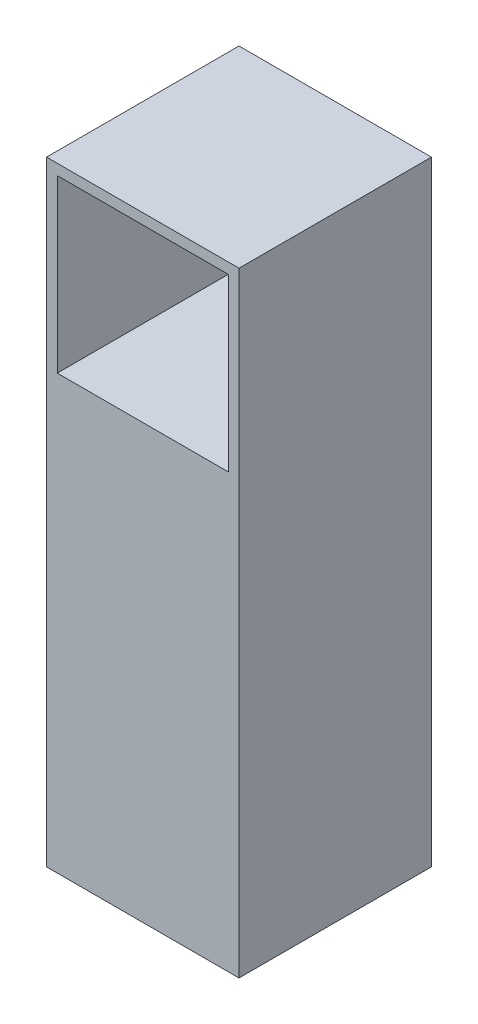
ISO-10303-21;
HEADER;
FILE_DESCRIPTION(('STEP AP214'),'2;1');
FILE_NAME('part.step','',(''),(''),'','','');
FILE_SCHEMA(('AUTOMOTIVE_DESIGN { 1 0 10303 214 1 1 1 1 }'));
ENDSEC;
DATA;
#1=APPLICATION_CONTEXT('core data for automotive mechanical design processes');
#2=APPLICATION_PROTOCOL_DEFINITION('international standard','automotive_design',2000,#1);
#3=PRODUCT_CONTEXT('',#1,'mechanical');
#4=PRODUCT('Part','Part','',(#3));
#5=PRODUCT_RELATED_PRODUCT_CATEGORY('part','',(#4));
#6=PRODUCT_DEFINITION_FORMATION('','',#4);
#7=PRODUCT_DEFINITION_CONTEXT('part definition',#1,'design');
#8=PRODUCT_DEFINITION('design','',#6,#7);
#9=PRODUCT_DEFINITION_SHAPE('','',#8);
#10=(LENGTH_UNIT() NAMED_UNIT(*) SI_UNIT(.MILLI.,.METRE.));
#11=(NAMED_UNIT(*) PLANE_ANGLE_UNIT() SI_UNIT($,.RADIAN.));
#12=(NAMED_UNIT(*) SI_UNIT($,.STERADIAN.) SOLID_ANGLE_UNIT());
#13=UNCERTAINTY_MEASURE_WITH_UNIT(LENGTH_MEASURE(1.E-05),#10,'distance_accuracy_value','');
#14=(GEOMETRIC_REPRESENTATION_CONTEXT(3) GLOBAL_UNCERTAINTY_ASSIGNED_CONTEXT((#13)) GLOBAL_UNIT_ASSIGNED_CONTEXT((#10,
#11,#12)) REPRESENTATION_CONTEXT('',''));
#15=CARTESIAN_POINT('',(0.,0.,0.));
#16=DIRECTION('',(0.,0.,1.));
#17=DIRECTION('',(1.,0.,0.));
#18=AXIS2_PLACEMENT_3D('',#15,#16,#17);
#19=CARTESIAN_POINT('',(-18.,115.,-18.));
#20=DIRECTION('',(1.,0.,0.));
#21=DIRECTION('',(0.,0.,-1.));
#22=AXIS2_PLACEMENT_3D('',#19,#20,#21);
#23=PLANE('',#22);
#24=DIRECTION('',(0.,0.,1.));
#25=VECTOR('',#24,1.);
#26=CARTESIAN_POINT('',(-18.,0.,-18.));
#27=LINE('',#26,#25);
#28=CARTESIAN_POINT('',(-18.,0.,-18.));
#29=VERTEX_POINT('',#28);
#30=CARTESIAN_POINT('',(-18.,0.,18.));
#31=VERTEX_POINT('',#30);
#32=EDGE_CURVE('E127',#29,#31,#27,.T.);
#33=ORIENTED_EDGE('',*,*,#32,.T.);
#34=DIRECTION('',(0.,-1.,0.));
#35=VECTOR('',#34,1.);
#36=CARTESIAN_POINT('',(-18.,115.,18.));
#37=LINE('',#36,#35);
#38=CARTESIAN_POINT('',(-18.,115.,18.));
#39=VERTEX_POINT('',#38);
#40=EDGE_CURVE('E156',#39,#31,#37,.T.);
#41=ORIENTED_EDGE('',*,*,#40,.F.);
#42=DIRECTION('',(0.,0.,1.));
#43=VECTOR('',#42,1.);
#44=CARTESIAN_POINT('',(-18.,115.,-18.));
#45=LINE('',#44,#43);
#46=CARTESIAN_POINT('',(-18.,115.,-18.));
#47=VERTEX_POINT('',#46);
#48=EDGE_CURVE('E130',#47,#39,#45,.T.);
#49=ORIENTED_EDGE('',*,*,#48,.F.);
#50=DIRECTION('',(0.,-1.,0.));
#51=VECTOR('',#50,1.);
#52=CARTESIAN_POINT('',(-18.,115.,-18.));
#53=LINE('',#52,#51);
#54=EDGE_CURVE('E140',#47,#29,#53,.T.);
#55=ORIENTED_EDGE('',*,*,#54,.T.);
#56=EDGE_LOOP('',(#33,#41,#49,#55));
#57=FACE_BOUND('',#56,.T.);
#58=ADVANCED_FACE('F37',(#57),#23,.F.);
#59=CARTESIAN_POINT('',(18.,115.,18.));
#60=DIRECTION('',(0.,0.,-1.));
#61=DIRECTION('',(-1.,0.,0.));
#62=AXIS2_PLACEMENT_3D('',#59,#60,#61);
#63=PLANE('',#62);
#64=DIRECTION('',(1.,0.,0.));
#65=VECTOR('',#64,1.);
#66=CARTESIAN_POINT('',(-16.,81.,18.));
#67=LINE('',#66,#65);
#68=CARTESIAN_POINT('',(-16.,81.,18.));
#69=VERTEX_POINT('',#68);
#70=CARTESIAN_POINT('',(16.,81.,18.));
#71=VERTEX_POINT('',#70);
#72=EDGE_CURVE('E113',#69,#71,#67,.T.);
#73=ORIENTED_EDGE('',*,*,#72,.F.);
#74=DIRECTION('',(0.,-1.,0.));
#75=VECTOR('',#74,1.);
#76=CARTESIAN_POINT('',(-16.,113.,18.));
#77=LINE('',#76,#75);
#78=CARTESIAN_POINT('',(-16.,113.,18.));
#79=VERTEX_POINT('',#78);
#80=EDGE_CURVE('E51',#79,#69,#77,.T.);
#81=ORIENTED_EDGE('',*,*,#80,.F.);
#82=DIRECTION('',(-1.,0.,0.));
#83=VECTOR('',#82,1.);
#84=CARTESIAN_POINT('',(-16.,113.,18.));
#85=LINE('',#84,#83);
#86=CARTESIAN_POINT('',(16.,113.,18.));
#87=VERTEX_POINT('',#86);
#88=EDGE_CURVE('E120',#87,#79,#85,.T.);
#89=ORIENTED_EDGE('',*,*,#88,.F.);
#90=DIRECTION('',(0.,1.,0.));
#91=VECTOR('',#90,1.);
#92=CARTESIAN_POINT('',(16.,113.,18.));
#93=LINE('',#92,#91);
#94=EDGE_CURVE('E104',#71,#87,#93,.T.);
#95=ORIENTED_EDGE('',*,*,#94,.F.);
#96=EDGE_LOOP('',(#73,#81,#89,#95));
#97=FACE_BOUND('',#96,.T.);
#98=DIRECTION('',(1.,0.,0.));
#99=VECTOR('',#98,1.);
#100=CARTESIAN_POINT('',(18.,0.,18.));
#101=LINE('',#100,#99);
#102=CARTESIAN_POINT('',(18.,0.,18.));
#103=VERTEX_POINT('',#102);
#104=EDGE_CURVE('E143',#31,#103,#101,.T.);
#105=ORIENTED_EDGE('',*,*,#104,.T.);
#106=DIRECTION('',(0.,-1.,0.));
#107=VECTOR('',#106,1.);
#108=CARTESIAN_POINT('',(18.,115.,18.));
#109=LINE('',#108,#107);
#110=CARTESIAN_POINT('',(18.,115.,18.));
#111=VERTEX_POINT('',#110);
#112=EDGE_CURVE('E153',#111,#103,#109,.T.);
#113=ORIENTED_EDGE('',*,*,#112,.F.);
#114=DIRECTION('',(1.,0.,0.));
#115=VECTOR('',#114,1.);
#116=CARTESIAN_POINT('',(18.,115.,18.));
#117=LINE('',#116,#115);
#118=EDGE_CURVE('E133',#39,#111,#117,.T.);
#119=ORIENTED_EDGE('',*,*,#118,.F.);
#120=ORIENTED_EDGE('',*,*,#40,.T.);
#121=EDGE_LOOP('',(#105,#113,#119,#120));
#122=FACE_BOUND('',#121,.T.);
#123=ADVANCED_FACE('F117',(#97,#122),#63,.F.);
#124=CARTESIAN_POINT('',(18.,115.,-18.));
#125=DIRECTION('',(-1.,0.,0.));
#126=DIRECTION('',(0.,0.,1.));
#127=AXIS2_PLACEMENT_3D('',#124,#125,#126);
#128=PLANE('',#127);
#129=DIRECTION('',(0.,0.,-1.));
#130=VECTOR('',#129,1.);
#131=CARTESIAN_POINT('',(18.,0.,-18.));
#132=LINE('',#131,#130);
#133=CARTESIAN_POINT('',(18.,0.,-18.));
#134=VERTEX_POINT('',#133);
#135=EDGE_CURVE('E145',#103,#134,#132,.T.);
#136=ORIENTED_EDGE('',*,*,#135,.T.);
#137=DIRECTION('',(0.,-1.,0.));
#138=VECTOR('',#137,1.);
#139=CARTESIAN_POINT('',(18.,115.,-18.));
#140=LINE('',#139,#138);
#141=CARTESIAN_POINT('',(18.,115.,-18.));
#142=VERTEX_POINT('',#141);
#143=EDGE_CURVE('E150',#142,#134,#140,.T.);
#144=ORIENTED_EDGE('',*,*,#143,.F.);
#145=DIRECTION('',(0.,0.,-1.));
#146=VECTOR('',#145,1.);
#147=CARTESIAN_POINT('',(18.,115.,-18.));
#148=LINE('',#147,#146);
#149=EDGE_CURVE('E136',#111,#142,#148,.T.);
#150=ORIENTED_EDGE('',*,*,#149,.F.);
#151=ORIENTED_EDGE('',*,*,#112,.T.);
#152=EDGE_LOOP('',(#136,#144,#150,#151));
#153=FACE_BOUND('',#152,.T.);
#154=ADVANCED_FACE('F187',(#153),#128,.F.);
#155=CARTESIAN_POINT('',(18.,115.,-18.));
#156=DIRECTION('',(0.,0.,1.));
#157=DIRECTION('',(1.,0.,0.));
#158=AXIS2_PLACEMENT_3D('',#155,#156,#157);
#159=PLANE('',#158);
#160=DIRECTION('',(-1.,0.,0.));
#161=VECTOR('',#160,1.);
#162=CARTESIAN_POINT('',(18.,113.,-18.));
#163=LINE('',#162,#161);
#164=CARTESIAN_POINT('',(16.,113.,-18.));
#165=VERTEX_POINT('',#164);
#166=CARTESIAN_POINT('',(-16.,113.,-18.));
#167=VERTEX_POINT('',#166);
#168=EDGE_CURVE('E44',#165,#167,#163,.T.);
#169=ORIENTED_EDGE('',*,*,#168,.T.);
#170=DIRECTION('',(0.,-1.,0.));
#171=VECTOR('',#170,1.);
#172=CARTESIAN_POINT('',(-16.,115.,-18.));
#173=LINE('',#172,#171);
#174=CARTESIAN_POINT('',(-16.,81.,-18.));
#175=VERTEX_POINT('',#174);
#176=EDGE_CURVE('E11',#167,#175,#173,.T.);
#177=ORIENTED_EDGE('',*,*,#176,.T.);
#178=DIRECTION('',(1.,0.,0.));
#179=VECTOR('',#178,1.);
#180=CARTESIAN_POINT('',(18.,81.,-18.));
#181=LINE('',#180,#179);
#182=CARTESIAN_POINT('',(16.,81.,-18.));
#183=VERTEX_POINT('',#182);
#184=EDGE_CURVE('E159',#175,#183,#181,.T.);
#185=ORIENTED_EDGE('',*,*,#184,.T.);
#186=DIRECTION('',(0.,1.,0.));
#187=VECTOR('',#186,1.);
#188=CARTESIAN_POINT('',(16.,115.,-18.));
#189=LINE('',#188,#187);
#190=EDGE_CURVE('E107',#183,#165,#189,.T.);
#191=ORIENTED_EDGE('',*,*,#190,.T.);
#192=EDGE_LOOP('',(#169,#177,#185,#191));
#193=FACE_BOUND('',#192,.T.);
#194=DIRECTION('',(-1.,0.,0.));
#195=VECTOR('',#194,1.);
#196=CARTESIAN_POINT('',(18.,0.,-18.));
#197=LINE('',#196,#195);
#198=EDGE_CURVE('E134',#134,#29,#197,.T.);
#199=ORIENTED_EDGE('',*,*,#198,.T.);
#200=ORIENTED_EDGE('',*,*,#54,.F.);
#201=DIRECTION('',(-1.,0.,0.));
#202=VECTOR('',#201,1.);
#203=CARTESIAN_POINT('',(18.,115.,-18.));
#204=LINE('',#203,#202);
#205=EDGE_CURVE('E138',#142,#47,#204,.T.);
#206=ORIENTED_EDGE('',*,*,#205,.F.);
#207=ORIENTED_EDGE('',*,*,#143,.T.);
#208=EDGE_LOOP('',(#199,#200,#206,#207));
#209=FACE_BOUND('',#208,.T.);
#210=ADVANCED_FACE('F163',(#193,#209),#159,.F.);
#211=CARTESIAN_POINT('',(0.,115.,0.));
#212=DIRECTION('',(0.,-1.,0.));
#213=DIRECTION('',(0.,0.,-1.));
#214=AXIS2_PLACEMENT_3D('',#211,#212,#213);
#215=PLANE('',#214);
#216=ORIENTED_EDGE('',*,*,#48,.T.);
#217=ORIENTED_EDGE('',*,*,#118,.T.);
#218=ORIENTED_EDGE('',*,*,#149,.T.);
#219=ORIENTED_EDGE('',*,*,#205,.T.);
#220=EDGE_LOOP('',(#216,#217,#218,#219));
#221=FACE_BOUND('',#220,.T.);
#222=ADVANCED_FACE('F177',(#221),#215,.F.);
#223=CARTESIAN_POINT('',(0.,0.,0.));
#224=DIRECTION('',(0.,-1.,0.));
#225=DIRECTION('',(0.,0.,-1.));
#226=AXIS2_PLACEMENT_3D('',#223,#224,#225);
#227=PLANE('',#226);
#228=ORIENTED_EDGE('',*,*,#32,.F.);
#229=ORIENTED_EDGE('',*,*,#198,.F.);
#230=ORIENTED_EDGE('',*,*,#135,.F.);
#231=ORIENTED_EDGE('',*,*,#104,.F.);
#232=EDGE_LOOP('',(#228,#229,#230,#231));
#233=FACE_BOUND('',#232,.T.);
#234=ADVANCED_FACE('F170',(#233),#227,.T.);
#235=CARTESIAN_POINT('',(-16.,113.,-97.));
#236=DIRECTION('',(-1.,0.,0.));
#237=DIRECTION('',(0.,-1.,0.));
#238=AXIS2_PLACEMENT_3D('',#235,#236,#237);
#239=PLANE('',#238);
#240=DIRECTION('',(0.,0.,1.));
#241=VECTOR('',#240,1.);
#242=CARTESIAN_POINT('',(-16.,113.,-97.));
#243=LINE('',#242,#241);
#244=EDGE_CURVE('E125',#167,#79,#243,.T.);
#245=ORIENTED_EDGE('',*,*,#244,.T.);
#246=ORIENTED_EDGE('',*,*,#80,.T.);
#247=DIRECTION('',(0.,0.,1.));
#248=VECTOR('',#247,1.);
#249=CARTESIAN_POINT('',(-16.,81.,-97.));
#250=LINE('',#249,#248);
#251=EDGE_CURVE('E110',#175,#69,#250,.T.);
#252=ORIENTED_EDGE('',*,*,#251,.F.);
#253=ORIENTED_EDGE('',*,*,#176,.F.);
#254=EDGE_LOOP('',(#245,#246,#252,#253));
#255=FACE_BOUND('',#254,.T.);
#256=ADVANCED_FACE('F168',(#255),#239,.F.);
#257=CARTESIAN_POINT('',(-16.,113.,-97.));
#258=DIRECTION('',(0.,1.,0.));
#259=DIRECTION('',(0.,0.,1.));
#260=AXIS2_PLACEMENT_3D('',#257,#258,#259);
#261=PLANE('',#260);
#262=DIRECTION('',(0.,0.,1.));
#263=VECTOR('',#262,1.);
#264=CARTESIAN_POINT('',(16.,113.,-97.));
#265=LINE('',#264,#263);
#266=EDGE_CURVE('E109',#165,#87,#265,.T.);
#267=ORIENTED_EDGE('',*,*,#266,.T.);
#268=ORIENTED_EDGE('',*,*,#88,.T.);
#269=ORIENTED_EDGE('',*,*,#244,.F.);
#270=ORIENTED_EDGE('',*,*,#168,.F.);
#271=EDGE_LOOP('',(#267,#268,#269,#270));
#272=FACE_BOUND('',#271,.T.);
#273=ADVANCED_FACE('F167',(#272),#261,.F.);
#274=CARTESIAN_POINT('',(16.,113.,-97.));
#275=DIRECTION('',(1.,0.,0.));
#276=DIRECTION('',(0.,1.,0.));
#277=AXIS2_PLACEMENT_3D('',#274,#275,#276);
#278=PLANE('',#277);
#279=DIRECTION('',(0.,0.,1.));
#280=VECTOR('',#279,1.);
#281=CARTESIAN_POINT('',(16.,81.,-97.));
#282=LINE('',#281,#280);
#283=EDGE_CURVE('E59',#183,#71,#282,.T.);
#284=ORIENTED_EDGE('',*,*,#283,.T.);
#285=ORIENTED_EDGE('',*,*,#94,.T.);
#286=ORIENTED_EDGE('',*,*,#266,.F.);
#287=ORIENTED_EDGE('',*,*,#190,.F.);
#288=EDGE_LOOP('',(#284,#285,#286,#287));
#289=FACE_BOUND('',#288,.T.);
#290=ADVANCED_FACE('F101',(#289),#278,.F.);
#291=CARTESIAN_POINT('',(-16.,81.,-97.));
#292=DIRECTION('',(0.,-1.,0.));
#293=DIRECTION('',(1.,0.,0.));
#294=AXIS2_PLACEMENT_3D('',#291,#292,#293);
#295=PLANE('',#294);
#296=ORIENTED_EDGE('',*,*,#251,.T.);
#297=ORIENTED_EDGE('',*,*,#72,.T.);
#298=ORIENTED_EDGE('',*,*,#283,.F.);
#299=ORIENTED_EDGE('',*,*,#184,.F.);
#300=EDGE_LOOP('',(#296,#297,#298,#299));
#301=FACE_BOUND('',#300,.T.);
#302=ADVANCED_FACE('F114',(#301),#295,.F.);
#303=CLOSED_SHELL('',(#58,#123,#154,#210,#222,#234,#256,#273,#290,#302));
#304=MANIFOLD_SOLID_BREP('B2',#303);
#305=ADVANCED_BREP_SHAPE_REPRESENTATION('',(#18,#304),#14);
#306=SHAPE_DEFINITION_REPRESENTATION(#9,#305);
ENDSEC;
END-ISO-10303-21;
